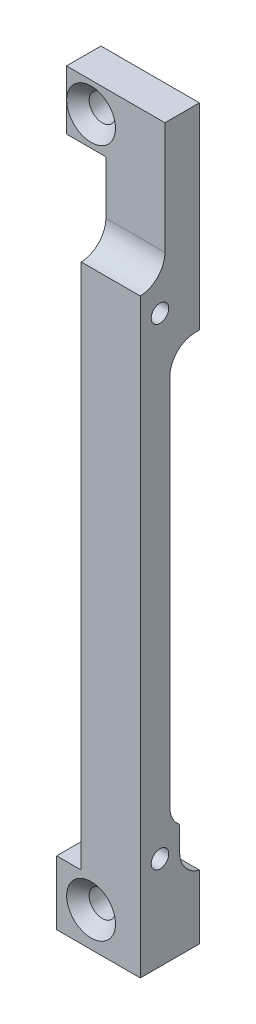
ISO-10303-21;
HEADER;
FILE_DESCRIPTION(('STEP AP214'),'2;1');
FILE_NAME('part.step','',(''),(''),'','','');
FILE_SCHEMA(('AUTOMOTIVE_DESIGN { 1 0 10303 214 1 1 1 1 }'));
ENDSEC;
DATA;
#1=APPLICATION_CONTEXT('core data for automotive mechanical design processes');
#2=APPLICATION_PROTOCOL_DEFINITION('international standard','automotive_design',2000,#1);
#3=PRODUCT_CONTEXT('',#1,'mechanical');
#4=PRODUCT('Part','Part','',(#3));
#5=PRODUCT_RELATED_PRODUCT_CATEGORY('part','',(#4));
#6=PRODUCT_DEFINITION_FORMATION('','',#4);
#7=PRODUCT_DEFINITION_CONTEXT('part definition',#1,'design');
#8=PRODUCT_DEFINITION('design','',#6,#7);
#9=PRODUCT_DEFINITION_SHAPE('','',#8);
#10=(LENGTH_UNIT() NAMED_UNIT(*) SI_UNIT(.MILLI.,.METRE.));
#11=(NAMED_UNIT(*) PLANE_ANGLE_UNIT() SI_UNIT($,.RADIAN.));
#12=(NAMED_UNIT(*) SI_UNIT($,.STERADIAN.) SOLID_ANGLE_UNIT());
#13=UNCERTAINTY_MEASURE_WITH_UNIT(LENGTH_MEASURE(1.E-05),#10,'distance_accuracy_value','');
#14=(GEOMETRIC_REPRESENTATION_CONTEXT(3) GLOBAL_UNCERTAINTY_ASSIGNED_CONTEXT((#13)) GLOBAL_UNIT_ASSIGNED_CONTEXT((#10,
#11,#12)) REPRESENTATION_CONTEXT('',''));
#15=CARTESIAN_POINT('',(0.,0.,0.));
#16=DIRECTION('',(0.,0.,1.));
#17=DIRECTION('',(1.,0.,0.));
#18=AXIS2_PLACEMENT_3D('',#15,#16,#17);
#19=CARTESIAN_POINT('',(-5.08,-25.4,3.81));
#20=DIRECTION('',(0.,0.,1.));
#21=DIRECTION('',(0.,-1.,0.));
#22=AXIS2_PLACEMENT_3D('',#19,#20,#21);
#23=PLANE('',#22);
#24=DIRECTION('',(0.,-1.,0.));
#25=VECTOR('',#24,1.);
#26=CARTESIAN_POINT('',(7.62,-25.4,3.81));
#27=LINE('',#26,#25);
#28=CARTESIAN_POINT('',(7.62,-28.702,3.81));
#29=VERTEX_POINT('',#28);
#30=CARTESIAN_POINT('',(7.62,-76.7722745054463,3.80999999999999));
#31=VERTEX_POINT('',#30);
#32=EDGE_CURVE('E272',#29,#31,#27,.T.);
#33=ORIENTED_EDGE('',*,*,#32,.T.);
#34=DIRECTION('',(-1.,0.,0.));
#35=VECTOR('',#34,1.);
#36=CARTESIAN_POINT('',(-5.08,-76.7722745054463,3.80999999999999));
#37=LINE('',#36,#35);
#38=CARTESIAN_POINT('',(0.,-76.7722745054463,3.80999999999999));
#39=VERTEX_POINT('',#38);
#40=EDGE_CURVE('E236',#31,#39,#37,.T.);
#41=ORIENTED_EDGE('',*,*,#40,.T.);
#42=DIRECTION('',(0.,-1.,0.));
#43=VECTOR('',#42,1.);
#44=CARTESIAN_POINT('',(0.,-93.98,3.80999999999999));
#45=LINE('',#44,#43);
#46=CARTESIAN_POINT('',(0.,-28.702,3.81));
#47=VERTEX_POINT('',#46);
#48=EDGE_CURVE('E218',#47,#39,#45,.T.);
#49=ORIENTED_EDGE('',*,*,#48,.F.);
#50=DIRECTION('',(1.,0.,0.));
#51=VECTOR('',#50,1.);
#52=CARTESIAN_POINT('',(7.62,-28.702,3.81));
#53=LINE('',#52,#51);
#54=EDGE_CURVE('E233',#47,#29,#53,.T.);
#55=ORIENTED_EDGE('',*,*,#54,.T.);
#56=EDGE_LOOP('',(#33,#41,#49,#55));
#57=FACE_BOUND('',#56,.T.);
#58=ADVANCED_FACE('F38',(#57),#23,.F.);
#59=CARTESIAN_POINT('',(-5.08,-85.725,0.));
#60=DIRECTION('',(0.,-1.,0.));
#61=DIRECTION('',(0.,0.,-1.));
#62=AXIS2_PLACEMENT_3D('',#59,#60,#61);
#63=PLANE('',#62);
#64=DIRECTION('',(0.,0.,1.));
#65=VECTOR('',#64,1.);
#66=CARTESIAN_POINT('',(0.,-85.725,0.));
#67=LINE('',#66,#65);
#68=CARTESIAN_POINT('',(0.,-85.725,0.));
#69=VERTEX_POINT('',#68);
#70=CARTESIAN_POINT('',(0.,-85.725,7.62));
#71=VERTEX_POINT('',#70);
#72=EDGE_CURVE('E312',#69,#71,#67,.T.);
#73=ORIENTED_EDGE('',*,*,#72,.F.);
#74=DIRECTION('',(1.,0.,0.));
#75=VECTOR('',#74,1.);
#76=CARTESIAN_POINT('',(7.62,-85.725,0.));
#77=LINE('',#76,#75);
#78=CARTESIAN_POINT('',(-3.175,-85.725,0.));
#79=VERTEX_POINT('',#78);
#80=EDGE_CURVE('E215',#79,#69,#77,.T.);
#81=ORIENTED_EDGE('',*,*,#80,.F.);
#82=DIRECTION('',(0.,0.,1.));
#83=VECTOR('',#82,1.);
#84=CARTESIAN_POINT('',(-3.175,-85.725,0.));
#85=LINE('',#84,#83);
#86=CARTESIAN_POINT('',(-3.175,-85.725,7.62));
#87=VERTEX_POINT('',#86);
#88=EDGE_CURVE('E279',#79,#87,#85,.T.);
#89=ORIENTED_EDGE('',*,*,#88,.T.);
#90=DIRECTION('',(1.,0.,0.));
#91=VECTOR('',#90,1.);
#92=CARTESIAN_POINT('',(-3.175,-85.725,7.62));
#93=LINE('',#92,#91);
#94=EDGE_CURVE('E275',#87,#71,#93,.T.);
#95=ORIENTED_EDGE('',*,*,#94,.T.);
#96=EDGE_LOOP('',(#73,#81,#89,#95));
#97=FACE_BOUND('',#96,.T.);
#98=ADVANCED_FACE('F375',(#97),#63,.F.);
#99=CARTESIAN_POINT('',(7.62,-93.98,7.62));
#100=DIRECTION('',(-1.,0.,0.));
#101=DIRECTION('',(0.,0.,1.));
#102=AXIS2_PLACEMENT_3D('',#99,#100,#101);
#103=PLANE('',#102);
#104=CARTESIAN_POINT('',(7.62,-20.9677,5.08));
#105=DIRECTION('',(1.,0.,0.));
#106=DIRECTION('',(0.,0.,-1.));
#107=AXIS2_PLACEMENT_3D('',#104,#105,#106);
#108=CIRCLE('',#107,1.13029999999999);
#109=CARTESIAN_POINT('',(7.62,-20.9677,3.94970000000001));
#110=VERTEX_POINT('',#109);
#111=EDGE_CURVE('E230',#110,#110,#108,.T.);
#112=ORIENTED_EDGE('',*,*,#111,.F.);
#113=EDGE_LOOP('',(#112));
#114=FACE_BOUND('',#113,.T.);
#115=CARTESIAN_POINT('',(7.62,-81.9277,5.07999999999999));
#116=DIRECTION('',(1.,0.,0.));
#117=DIRECTION('',(0.,0.,-1.));
#118=AXIS2_PLACEMENT_3D('',#115,#116,#117);
#119=CIRCLE('',#118,1.13029999999999);
#120=CARTESIAN_POINT('',(7.62,-81.9277,3.9497));
#121=VERTEX_POINT('',#120);
#122=EDGE_CURVE('E226',#121,#121,#119,.T.);
#123=ORIENTED_EDGE('',*,*,#122,.F.);
#124=EDGE_LOOP('',(#123));
#125=FACE_BOUND('',#124,.T.);
#126=DIRECTION('',(0.,1.,0.));
#127=VECTOR('',#126,1.);
#128=CARTESIAN_POINT('',(7.62,-93.98,7.62));
#129=LINE('',#128,#127);
#130=CARTESIAN_POINT('',(7.62,-93.98,7.62));
#131=VERTEX_POINT('',#130);
#132=CARTESIAN_POINT('',(7.61999999999999,-17.78,7.62));
#133=VERTEX_POINT('',#132);
#134=EDGE_CURVE('E153',#131,#133,#129,.T.);
#135=ORIENTED_EDGE('',*,*,#134,.F.);
#136=DIRECTION('',(0.,0.,-1.));
#137=VECTOR('',#136,1.);
#138=CARTESIAN_POINT('',(7.62,-93.98,7.62));
#139=LINE('',#138,#137);
#140=CARTESIAN_POINT('',(7.62,-93.98,0.));
#141=VERTEX_POINT('',#140);
#142=EDGE_CURVE('E157',#131,#141,#139,.T.);
#143=ORIENTED_EDGE('',*,*,#142,.T.);
#144=DIRECTION('',(0.,1.,0.));
#145=VECTOR('',#144,1.);
#146=CARTESIAN_POINT('',(7.62,0.,0.));
#147=LINE('',#146,#145);
#148=CARTESIAN_POINT('',(7.62,-85.725,0.));
#149=VERTEX_POINT('',#148);
#150=EDGE_CURVE('E172',#141,#149,#147,.T.);
#151=ORIENTED_EDGE('',*,*,#150,.T.);
#152=CARTESIAN_POINT('',(7.62,-82.5121258972689,-0.762000000000007));
#153=DIRECTION('',(-1.,0.,0.));
#154=DIRECTION('',(0.,0.,1.));
#155=AXIS2_PLACEMENT_3D('',#152,#153,#154);
#156=CIRCLE('',#155,3.302);
#157=CARTESIAN_POINT('',(7.62,-82.5121258972689,2.53999999999999));
#158=VERTEX_POINT('',#157);
#159=EDGE_CURVE('E245',#149,#158,#156,.T.);
#160=ORIENTED_EDGE('',*,*,#159,.T.);
#161=DIRECTION('',(0.,-1.,0.));
#162=VECTOR('',#161,1.);
#163=CARTESIAN_POINT('',(7.62,-85.725,2.53999999999999));
#164=LINE('',#163,#162);
#165=CARTESIAN_POINT('',(7.62,-79.375,2.53999999999999));
#166=VERTEX_POINT('',#165);
#167=EDGE_CURVE('E330',#166,#158,#164,.T.);
#168=ORIENTED_EDGE('',*,*,#167,.F.);
#169=CARTESIAN_POINT('',(7.62,-76.7722745054463,0.507999999999994));
#170=DIRECTION('',(-1.,0.,0.));
#171=DIRECTION('',(0.,0.,1.));
#172=AXIS2_PLACEMENT_3D('',#169,#170,#171);
#173=CIRCLE('',#172,3.302);
#174=EDGE_CURVE('E247',#166,#31,#173,.T.);
#175=ORIENTED_EDGE('',*,*,#174,.T.);
#176=ORIENTED_EDGE('',*,*,#32,.F.);
#177=CARTESIAN_POINT('',(7.62,-28.702,0.507999999999999));
#178=DIRECTION('',(-1.,0.,0.));
#179=DIRECTION('',(0.,0.,1.));
#180=AXIS2_PLACEMENT_3D('',#177,#178,#179);
#181=CIRCLE('',#180,3.302);
#182=CARTESIAN_POINT('',(7.62,-25.4,0.508000000000002));
#183=VERTEX_POINT('',#182);
#184=EDGE_CURVE('E251',#29,#183,#181,.T.);
#185=ORIENTED_EDGE('',*,*,#184,.T.);
#186=DIRECTION('',(0.,0.,1.));
#187=VECTOR('',#186,1.);
#188=CARTESIAN_POINT('',(7.62,-25.4,0.));
#189=LINE('',#188,#187);
#190=CARTESIAN_POINT('',(7.62,-25.4,0.));
#191=VERTEX_POINT('',#190);
#192=EDGE_CURVE('E270',#191,#183,#189,.T.);
#193=ORIENTED_EDGE('',*,*,#192,.F.);
#194=DIRECTION('',(0.,1.,0.));
#195=VECTOR('',#194,1.);
#196=CARTESIAN_POINT('',(7.62,-93.98,0.));
#197=LINE('',#196,#195);
#198=CARTESIAN_POINT('',(7.62,0.,0.));
#199=VERTEX_POINT('',#198);
#200=EDGE_CURVE('E192',#191,#199,#197,.T.);
#201=ORIENTED_EDGE('',*,*,#200,.T.);
#202=DIRECTION('',(0.,0.,-1.));
#203=VECTOR('',#202,1.);
#204=CARTESIAN_POINT('',(7.62,0.,7.62));
#205=LINE('',#204,#203);
#206=CARTESIAN_POINT('',(7.62,0.,4.445));
#207=VERTEX_POINT('',#206);
#208=EDGE_CURVE('E171',#207,#199,#205,.T.);
#209=ORIENTED_EDGE('',*,*,#208,.F.);
#210=DIRECTION('',(0.,1.,0.));
#211=VECTOR('',#210,1.);
#212=CARTESIAN_POINT('',(7.62,-93.98,4.445));
#213=LINE('',#212,#211);
#214=CARTESIAN_POINT('',(7.62,-14.4804432115813,4.445));
#215=VERTEX_POINT('',#214);
#216=EDGE_CURVE('E185',#215,#207,#213,.T.);
#217=ORIENTED_EDGE('',*,*,#216,.F.);
#218=CARTESIAN_POINT('',(7.62,-14.4804432115813,7.747));
#219=DIRECTION('',(-1.,0.,0.));
#220=DIRECTION('',(0.,0.,1.));
#221=AXIS2_PLACEMENT_3D('',#218,#219,#220);
#222=CIRCLE('',#221,3.302);
#223=EDGE_CURVE('E46',#215,#133,#222,.T.);
#224=ORIENTED_EDGE('',*,*,#223,.T.);
#225=EDGE_LOOP('',(#135,#143,#151,#160,#168,#175,#176,#185,#193,#201,#209,#217,#224));
#226=FACE_BOUND('',#225,.T.);
#227=ADVANCED_FACE('F155',(#114,#125,#226),#103,.F.);
#228=CARTESIAN_POINT('',(7.62,-93.98,0.));
#229=DIRECTION('',(0.,0.,1.));
#230=DIRECTION('',(1.,0.,0.));
#231=AXIS2_PLACEMENT_3D('',#228,#229,#230);
#232=PLANE('',#231);
#233=CARTESIAN_POINT('',(1.26999999999999,-89.535,0.));
#234=DIRECTION('',(0.,0.,1.));
#235=DIRECTION('',(1.,0.,0.));
#236=AXIS2_PLACEMENT_3D('',#233,#234,#235);
#237=CIRCLE('',#236,1.7);
#238=CARTESIAN_POINT('',(2.96999999999998,-89.535,0.));
#239=VERTEX_POINT('',#238);
#240=EDGE_CURVE('E333',#239,#239,#237,.T.);
#241=ORIENTED_EDGE('',*,*,#240,.T.);
#242=EDGE_LOOP('',(#241));
#243=FACE_BOUND('',#242,.T.);
#244=ORIENTED_EDGE('',*,*,#80,.T.);
#245=EDGE_CURVE('E214',#69,#149,#77,.T.);
#246=ORIENTED_EDGE('',*,*,#245,.T.);
#247=ORIENTED_EDGE('',*,*,#150,.F.);
#248=DIRECTION('',(1.,0.,0.));
#249=VECTOR('',#248,1.);
#250=CARTESIAN_POINT('',(0.,-93.98,0.));
#251=LINE('',#250,#249);
#252=CARTESIAN_POINT('',(-3.175,-93.98,0.));
#253=VERTEX_POINT('',#252);
#254=EDGE_CURVE('E170',#253,#141,#251,.T.);
#255=ORIENTED_EDGE('',*,*,#254,.F.);
#256=DIRECTION('',(0.,1.,0.));
#257=VECTOR('',#256,1.);
#258=CARTESIAN_POINT('',(-3.175,-85.725,0.));
#259=LINE('',#258,#257);
#260=EDGE_CURVE('E315',#253,#79,#259,.T.);
#261=ORIENTED_EDGE('',*,*,#260,.T.);
#262=EDGE_LOOP('',(#244,#246,#247,#255,#261));
#263=FACE_BOUND('',#262,.T.);
#264=ADVANCED_FACE('F393',(#243,#263),#232,.F.);
#265=CARTESIAN_POINT('',(-5.08,0.,7.62));
#266=DIRECTION('',(0.,-1.,0.));
#267=DIRECTION('',(0.,0.,-1.));
#268=AXIS2_PLACEMENT_3D('',#265,#266,#267);
#269=PLANE('',#268);
#270=DIRECTION('',(-1.,0.,0.));
#271=VECTOR('',#270,1.);
#272=CARTESIAN_POINT('',(-5.08,0.,4.445));
#273=LINE('',#272,#271);
#274=CARTESIAN_POINT('',(-5.08,0.,4.445));
#275=VERTEX_POINT('',#274);
#276=EDGE_CURVE('E286',#207,#275,#273,.T.);
#277=ORIENTED_EDGE('',*,*,#276,.F.);
#278=ORIENTED_EDGE('',*,*,#208,.T.);
#279=DIRECTION('',(-1.,0.,0.));
#280=VECTOR('',#279,1.);
#281=CARTESIAN_POINT('',(-5.08,0.,0.));
#282=LINE('',#281,#280);
#283=CARTESIAN_POINT('',(-5.08,0.,0.));
#284=VERTEX_POINT('',#283);
#285=EDGE_CURVE('E194',#199,#284,#282,.T.);
#286=ORIENTED_EDGE('',*,*,#285,.T.);
#287=DIRECTION('',(0.,0.,-1.));
#288=VECTOR('',#287,1.);
#289=CARTESIAN_POINT('',(-5.08,0.,7.62));
#290=LINE('',#289,#288);
#291=EDGE_CURVE('E204',#275,#284,#290,.T.);
#292=ORIENTED_EDGE('',*,*,#291,.F.);
#293=EDGE_LOOP('',(#277,#278,#286,#292));
#294=FACE_BOUND('',#293,.T.);
#295=ADVANCED_FACE('F300',(#294),#269,.F.);
#296=CARTESIAN_POINT('',(-5.08,-7.62,7.62));
#297=DIRECTION('',(1.,0.,0.));
#298=DIRECTION('',(0.,0.,-1.));
#299=AXIS2_PLACEMENT_3D('',#296,#297,#298);
#300=PLANE('',#299);
#301=DIRECTION('',(0.,-1.,0.));
#302=VECTOR('',#301,1.);
#303=CARTESIAN_POINT('',(-5.08,0.,4.445));
#304=LINE('',#303,#302);
#305=CARTESIAN_POINT('',(-5.08,-7.62,4.445));
#306=VERTEX_POINT('',#305);
#307=EDGE_CURVE('E284',#275,#306,#304,.T.);
#308=ORIENTED_EDGE('',*,*,#307,.F.);
#309=ORIENTED_EDGE('',*,*,#291,.T.);
#310=DIRECTION('',(0.,-1.,0.));
#311=VECTOR('',#310,1.);
#312=CARTESIAN_POINT('',(-5.08,-7.62,0.));
#313=LINE('',#312,#311);
#314=CARTESIAN_POINT('',(-5.08,-7.62,0.));
#315=VERTEX_POINT('',#314);
#316=EDGE_CURVE('E196',#284,#315,#313,.T.);
#317=ORIENTED_EDGE('',*,*,#316,.T.);
#318=DIRECTION('',(0.,0.,-1.));
#319=VECTOR('',#318,1.);
#320=CARTESIAN_POINT('',(-5.08,-7.62,7.62));
#321=LINE('',#320,#319);
#322=EDGE_CURVE('E202',#306,#315,#321,.T.);
#323=ORIENTED_EDGE('',*,*,#322,.F.);
#324=EDGE_LOOP('',(#308,#309,#317,#323));
#325=FACE_BOUND('',#324,.T.);
#326=ADVANCED_FACE('F303',(#325),#300,.F.);
#327=CARTESIAN_POINT('',(0.,-7.62,7.62));
#328=DIRECTION('',(0.,1.,0.));
#329=DIRECTION('',(-1.,0.,0.));
#330=AXIS2_PLACEMENT_3D('',#327,#328,#329);
#331=PLANE('',#330);
#332=DIRECTION('',(1.,0.,0.));
#333=VECTOR('',#332,1.);
#334=CARTESIAN_POINT('',(0.,-7.62,4.445));
#335=LINE('',#334,#333);
#336=CARTESIAN_POINT('',(0.,-7.62,4.445));
#337=VERTEX_POINT('',#336);
#338=EDGE_CURVE('E287',#306,#337,#335,.T.);
#339=ORIENTED_EDGE('',*,*,#338,.F.);
#340=ORIENTED_EDGE('',*,*,#322,.T.);
#341=DIRECTION('',(1.,0.,0.));
#342=VECTOR('',#341,1.);
#343=CARTESIAN_POINT('',(0.,-7.62,0.));
#344=LINE('',#343,#342);
#345=CARTESIAN_POINT('',(0.,-7.62,0.));
#346=VERTEX_POINT('',#345);
#347=EDGE_CURVE('E182',#315,#346,#344,.T.);
#348=ORIENTED_EDGE('',*,*,#347,.T.);
#349=DIRECTION('',(0.,0.,-1.));
#350=VECTOR('',#349,1.);
#351=CARTESIAN_POINT('',(0.,-7.62,7.62));
#352=LINE('',#351,#350);
#353=EDGE_CURVE('E190',#337,#346,#352,.T.);
#354=ORIENTED_EDGE('',*,*,#353,.F.);
#355=EDGE_LOOP('',(#339,#340,#348,#354));
#356=FACE_BOUND('',#355,.T.);
#357=ADVANCED_FACE('F311',(#356),#331,.F.);
#358=CARTESIAN_POINT('',(0.,-93.98,7.62));
#359=DIRECTION('',(0.,1.,0.));
#360=DIRECTION('',(0.,0.,1.));
#361=AXIS2_PLACEMENT_3D('',#358,#359,#360);
#362=PLANE('',#361);
#363=ORIENTED_EDGE('',*,*,#254,.T.);
#364=ORIENTED_EDGE('',*,*,#142,.F.);
#365=DIRECTION('',(1.,0.,0.));
#366=VECTOR('',#365,1.);
#367=CARTESIAN_POINT('',(0.,-93.98,7.62));
#368=LINE('',#367,#366);
#369=CARTESIAN_POINT('',(-3.175,-93.98,7.62));
#370=VERTEX_POINT('',#369);
#371=EDGE_CURVE('E163',#370,#131,#368,.T.);
#372=ORIENTED_EDGE('',*,*,#371,.F.);
#373=DIRECTION('',(0.,0.,-1.));
#374=VECTOR('',#373,1.);
#375=CARTESIAN_POINT('',(-3.175,-93.98,0.));
#376=LINE('',#375,#374);
#377=EDGE_CURVE('E318',#370,#253,#376,.T.);
#378=ORIENTED_EDGE('',*,*,#377,.T.);
#379=EDGE_LOOP('',(#363,#364,#372,#378));
#380=FACE_BOUND('',#379,.T.);
#381=ADVANCED_FACE('F167',(#380),#362,.F.);
#382=CARTESIAN_POINT('',(0.,-93.98,7.62));
#383=DIRECTION('',(1.,0.,0.));
#384=DIRECTION('',(0.,0.,-1.));
#385=AXIS2_PLACEMENT_3D('',#382,#383,#384);
#386=PLANE('',#385);
#387=CARTESIAN_POINT('',(0.,-20.9677,5.08));
#388=DIRECTION('',(1.,0.,0.));
#389=DIRECTION('',(0.,0.,-1.));
#390=AXIS2_PLACEMENT_3D('',#387,#388,#389);
#391=CIRCLE('',#390,1.13029999999999);
#392=CARTESIAN_POINT('',(0.,-20.9677,3.94970000000001));
#393=VERTEX_POINT('',#392);
#394=EDGE_CURVE('E227',#393,#393,#391,.T.);
#395=ORIENTED_EDGE('',*,*,#394,.T.);
#396=EDGE_LOOP('',(#395));
#397=FACE_BOUND('',#396,.T.);
#398=CARTESIAN_POINT('',(0.,-81.9277,5.07999999999999));
#399=DIRECTION('',(1.,0.,0.));
#400=DIRECTION('',(0.,0.,-1.));
#401=AXIS2_PLACEMENT_3D('',#398,#399,#400);
#402=CIRCLE('',#401,1.13029999999999);
#403=CARTESIAN_POINT('',(0.,-81.9277,3.9497));
#404=VERTEX_POINT('',#403);
#405=EDGE_CURVE('E222',#404,#404,#402,.T.);
#406=ORIENTED_EDGE('',*,*,#405,.T.);
#407=EDGE_LOOP('',(#406));
#408=FACE_BOUND('',#407,.T.);
#409=DIRECTION('',(0.,0.,1.));
#410=VECTOR('',#409,1.);
#411=CARTESIAN_POINT('',(0.,-25.4,7.62000000000006));
#412=LINE('',#411,#410);
#413=CARTESIAN_POINT('',(0.,-25.4,0.));
#414=VERTEX_POINT('',#413);
#415=CARTESIAN_POINT('',(0.,-25.4,0.508000000000002));
#416=VERTEX_POINT('',#415);
#417=EDGE_CURVE('E259',#414,#416,#412,.T.);
#418=ORIENTED_EDGE('',*,*,#417,.T.);
#419=CARTESIAN_POINT('',(0.,-28.702,0.507999999999999));
#420=DIRECTION('',(1.,0.,0.));
#421=DIRECTION('',(0.,0.,-1.));
#422=AXIS2_PLACEMENT_3D('',#419,#420,#421);
#423=CIRCLE('',#422,3.302);
#424=EDGE_CURVE('E253',#416,#47,#423,.T.);
#425=ORIENTED_EDGE('',*,*,#424,.T.);
#426=ORIENTED_EDGE('',*,*,#48,.T.);
#427=CARTESIAN_POINT('',(0.,-76.7722745054463,0.507999999999994));
#428=DIRECTION('',(1.,0.,0.));
#429=DIRECTION('',(0.,0.,-1.));
#430=AXIS2_PLACEMENT_3D('',#427,#428,#429);
#431=CIRCLE('',#430,3.302);
#432=CARTESIAN_POINT('',(0.,-79.375,2.53999999999999));
#433=VERTEX_POINT('',#432);
#434=EDGE_CURVE('E249',#39,#433,#431,.T.);
#435=ORIENTED_EDGE('',*,*,#434,.T.);
#436=DIRECTION('',(0.,1.,0.));
#437=VECTOR('',#436,1.);
#438=CARTESIAN_POINT('',(0.,-85.725,2.53999999999999));
#439=LINE('',#438,#437);
#440=CARTESIAN_POINT('',(0.,-82.5121258972689,2.53999999999999));
#441=VERTEX_POINT('',#440);
#442=EDGE_CURVE('E321',#441,#433,#439,.T.);
#443=ORIENTED_EDGE('',*,*,#442,.F.);
#444=CARTESIAN_POINT('',(0.,-82.5121258972689,-0.762000000000007));
#445=DIRECTION('',(1.,0.,0.));
#446=DIRECTION('',(0.,0.,-1.));
#447=AXIS2_PLACEMENT_3D('',#444,#445,#446);
#448=CIRCLE('',#447,3.302);
#449=EDGE_CURVE('E242',#441,#69,#448,.T.);
#450=ORIENTED_EDGE('',*,*,#449,.T.);
#451=ORIENTED_EDGE('',*,*,#72,.T.);
#452=DIRECTION('',(0.,-1.,0.));
#453=VECTOR('',#452,1.);
#454=CARTESIAN_POINT('',(0.,-93.98,7.62));
#455=LINE('',#454,#453);
#456=CARTESIAN_POINT('',(0.,-17.78,7.62));
#457=VERTEX_POINT('',#456);
#458=EDGE_CURVE('E162',#457,#71,#455,.T.);
#459=ORIENTED_EDGE('',*,*,#458,.F.);
#460=CARTESIAN_POINT('',(0.,-14.4804432115813,7.747));
#461=DIRECTION('',(1.,0.,0.));
#462=DIRECTION('',(0.,0.,-1.));
#463=AXIS2_PLACEMENT_3D('',#460,#461,#462);
#464=CIRCLE('',#463,3.302);
#465=CARTESIAN_POINT('',(0.,-14.4804432115813,4.445));
#466=VERTEX_POINT('',#465);
#467=EDGE_CURVE('E11',#457,#466,#464,.T.);
#468=ORIENTED_EDGE('',*,*,#467,.T.);
#469=DIRECTION('',(0.,-1.,0.));
#470=VECTOR('',#469,1.);
#471=CARTESIAN_POINT('',(0.,-93.98,4.445));
#472=LINE('',#471,#470);
#473=EDGE_CURVE('E209',#337,#466,#472,.T.);
#474=ORIENTED_EDGE('',*,*,#473,.F.);
#475=ORIENTED_EDGE('',*,*,#353,.T.);
#476=DIRECTION('',(0.,-1.,0.));
#477=VECTOR('',#476,1.);
#478=CARTESIAN_POINT('',(0.,-93.98,0.));
#479=LINE('',#478,#477);
#480=EDGE_CURVE('E179',#346,#414,#479,.T.);
#481=ORIENTED_EDGE('',*,*,#480,.T.);
#482=EDGE_LOOP('',(#418,#425,#426,#435,#443,#450,#451,#459,#468,#474,#475,#481));
#483=FACE_BOUND('',#482,.T.);
#484=ADVANCED_FACE('F257',(#397,#408,#483),#386,.F.);
#485=CARTESIAN_POINT('',(7.62,-93.98,7.62));
#486=DIRECTION('',(0.,0.,1.));
#487=DIRECTION('',(1.,0.,0.));
#488=AXIS2_PLACEMENT_3D('',#485,#486,#487);
#489=PLANE('',#488);
#490=ORIENTED_EDGE('',*,*,#371,.T.);
#491=ORIENTED_EDGE('',*,*,#134,.T.);
#492=DIRECTION('',(1.,0.,0.));
#493=VECTOR('',#492,1.);
#494=CARTESIAN_POINT('',(7.62,-17.78,7.62));
#495=LINE('',#494,#493);
#496=EDGE_CURVE('E207',#457,#133,#495,.T.);
#497=ORIENTED_EDGE('',*,*,#496,.F.);
#498=ORIENTED_EDGE('',*,*,#458,.T.);
#499=ORIENTED_EDGE('',*,*,#94,.F.);
#500=DIRECTION('',(0.,-1.,0.));
#501=VECTOR('',#500,1.);
#502=CARTESIAN_POINT('',(-3.175,-85.725,7.62));
#503=LINE('',#502,#501);
#504=EDGE_CURVE('E178',#87,#370,#503,.T.);
#505=ORIENTED_EDGE('',*,*,#504,.T.);
#506=EDGE_LOOP('',(#490,#491,#497,#498,#499,#505));
#507=FACE_BOUND('',#506,.T.);
#508=CARTESIAN_POINT('',(1.26999999999999,-89.535,7.62));
#509=DIRECTION('',(0.,0.,1.));
#510=DIRECTION('',(1.,0.,0.));
#511=AXIS2_PLACEMENT_3D('',#508,#509,#510);
#512=CIRCLE('',#511,3.15);
#513=CARTESIAN_POINT('',(4.41999999999999,-89.535,7.62));
#514=VERTEX_POINT('',#513);
#515=EDGE_CURVE('E339',#514,#514,#512,.T.);
#516=ORIENTED_EDGE('',*,*,#515,.F.);
#517=EDGE_LOOP('',(#516));
#518=FACE_BOUND('',#517,.T.);
#519=ADVANCED_FACE('F175',(#507,#518),#489,.T.);
#520=CARTESIAN_POINT('',(-1.905,-3.81,0.));
#521=DIRECTION('',(0.,0.,1.));
#522=DIRECTION('',(1.,0.,0.));
#523=AXIS2_PLACEMENT_3D('',#520,#521,#522);
#524=CIRCLE('',#523,1.7);
#525=CARTESIAN_POINT('',(-0.205000000000001,-3.81,0.));
#526=VERTEX_POINT('',#525);
#527=EDGE_CURVE('E342',#526,#526,#524,.T.);
#528=ORIENTED_EDGE('',*,*,#527,.T.);
#529=EDGE_LOOP('',(#528));
#530=FACE_BOUND('',#529,.T.);
#531=ORIENTED_EDGE('',*,*,#285,.F.);
#532=ORIENTED_EDGE('',*,*,#200,.F.);
#533=DIRECTION('',(-1.,0.,0.));
#534=VECTOR('',#533,1.);
#535=CARTESIAN_POINT('',(7.62,-25.4,0.));
#536=LINE('',#535,#534);
#537=EDGE_CURVE('E211',#191,#414,#536,.T.);
#538=ORIENTED_EDGE('',*,*,#537,.T.);
#539=ORIENTED_EDGE('',*,*,#480,.F.);
#540=ORIENTED_EDGE('',*,*,#347,.F.);
#541=ORIENTED_EDGE('',*,*,#316,.F.);
#542=EDGE_LOOP('',(#531,#532,#538,#539,#540,#541));
#543=FACE_BOUND('',#542,.T.);
#544=ADVANCED_FACE('F307',(#530,#543),#232,.F.);
#545=CARTESIAN_POINT('',(-5.08,-17.78,4.445));
#546=DIRECTION('',(0.,0.,1.));
#547=DIRECTION('',(1.,0.,0.));
#548=AXIS2_PLACEMENT_3D('',#545,#546,#547);
#549=PLANE('',#548);
#550=ORIENTED_EDGE('',*,*,#473,.T.);
#551=DIRECTION('',(1.,0.,0.));
#552=VECTOR('',#551,1.);
#553=CARTESIAN_POINT('',(7.61999999999999,-14.4804432115813,4.445));
#554=LINE('',#553,#552);
#555=EDGE_CURVE('E240',#466,#215,#554,.T.);
#556=ORIENTED_EDGE('',*,*,#555,.T.);
#557=ORIENTED_EDGE('',*,*,#216,.T.);
#558=ORIENTED_EDGE('',*,*,#276,.T.);
#559=ORIENTED_EDGE('',*,*,#307,.T.);
#560=ORIENTED_EDGE('',*,*,#338,.T.);
#561=EDGE_LOOP('',(#550,#556,#557,#558,#559,#560));
#562=FACE_BOUND('',#561,.T.);
#563=CARTESIAN_POINT('',(-1.905,-3.81,4.445));
#564=DIRECTION('',(0.,0.,1.));
#565=DIRECTION('',(1.,0.,0.));
#566=AXIS2_PLACEMENT_3D('',#563,#564,#565);
#567=CIRCLE('',#566,3.15);
#568=CARTESIAN_POINT('',(1.245,-3.81,4.445));
#569=VERTEX_POINT('',#568);
#570=EDGE_CURVE('E225',#569,#569,#567,.T.);
#571=ORIENTED_EDGE('',*,*,#570,.F.);
#572=EDGE_LOOP('',(#571));
#573=FACE_BOUND('',#572,.T.);
#574=ADVANCED_FACE('F291',(#562,#573),#549,.T.);
#575=CARTESIAN_POINT('',(-5.08,-25.4,0.));
#576=DIRECTION('',(0.,1.,0.));
#577=DIRECTION('',(0.,0.,1.));
#578=AXIS2_PLACEMENT_3D('',#575,#576,#577);
#579=PLANE('',#578);
#580=ORIENTED_EDGE('',*,*,#192,.T.);
#581=DIRECTION('',(1.,0.,0.));
#582=VECTOR('',#581,1.);
#583=CARTESIAN_POINT('',(0.,-25.4,0.508000000000002));
#584=LINE('',#583,#582);
#585=EDGE_CURVE('E238',#183,#416,#584,.F.);
#586=ORIENTED_EDGE('',*,*,#585,.T.);
#587=ORIENTED_EDGE('',*,*,#417,.F.);
#588=ORIENTED_EDGE('',*,*,#537,.F.);
#589=EDGE_LOOP('',(#580,#586,#587,#588));
#590=FACE_BOUND('',#589,.T.);
#591=ADVANCED_FACE('F274',(#590),#579,.F.);
#592=CARTESIAN_POINT('',(-3.175,-93.98,0.));
#593=DIRECTION('',(1.,0.,0.));
#594=DIRECTION('',(0.,0.,1.));
#595=AXIS2_PLACEMENT_3D('',#592,#593,#594);
#596=PLANE('',#595);
#597=ORIENTED_EDGE('',*,*,#260,.F.);
#598=ORIENTED_EDGE('',*,*,#377,.F.);
#599=ORIENTED_EDGE('',*,*,#504,.F.);
#600=ORIENTED_EDGE('',*,*,#88,.F.);
#601=EDGE_LOOP('',(#597,#598,#599,#600));
#602=FACE_BOUND('',#601,.T.);
#603=ADVANCED_FACE('F385',(#602),#596,.F.);
#604=CARTESIAN_POINT('',(7.62,-79.375,2.53999999999999));
#605=DIRECTION('',(0.,0.,1.));
#606=DIRECTION('',(0.,-1.,0.));
#607=AXIS2_PLACEMENT_3D('',#604,#605,#606);
#608=PLANE('',#607);
#609=ORIENTED_EDGE('',*,*,#167,.T.);
#610=DIRECTION('',(-1.,0.,0.));
#611=VECTOR('',#610,1.);
#612=CARTESIAN_POINT('',(7.62,-82.5121258972689,2.53999999999999));
#613=LINE('',#612,#611);
#614=EDGE_CURVE('E221',#158,#441,#613,.T.);
#615=ORIENTED_EDGE('',*,*,#614,.T.);
#616=ORIENTED_EDGE('',*,*,#442,.T.);
#617=DIRECTION('',(1.,0.,0.));
#618=VECTOR('',#617,1.);
#619=CARTESIAN_POINT('',(7.62,-79.375,2.53999999999999));
#620=LINE('',#619,#618);
#621=EDGE_CURVE('E316',#433,#166,#620,.T.);
#622=ORIENTED_EDGE('',*,*,#621,.T.);
#623=EDGE_LOOP('',(#609,#615,#616,#622));
#624=FACE_BOUND('',#623,.T.);
#625=ADVANCED_FACE('F362',(#624),#608,.F.);
#626=CARTESIAN_POINT('',(1.26999999999999,-89.535,7.62));
#627=DIRECTION('',(0.,0.,1.));
#628=DIRECTION('',(1.,0.,0.));
#629=AXIS2_PLACEMENT_3D('',#626,#627,#628);
#630=CYLINDRICAL_SURFACE('',#629,1.69999999999999);
#631=ORIENTED_EDGE('',*,*,#240,.F.);
#632=EDGE_LOOP('',(#631));
#633=FACE_BOUND('',#632,.T.);
#634=CARTESIAN_POINT('',(1.26999999999999,-89.535,6.16999999999999));
#635=DIRECTION('',(0.,0.,1.));
#636=DIRECTION('',(1.,0.,0.));
#637=AXIS2_PLACEMENT_3D('',#634,#635,#636);
#638=CIRCLE('',#637,1.69999999999999);
#639=CARTESIAN_POINT('',(2.96999999999997,-89.535,6.16999999999999));
#640=VERTEX_POINT('',#639);
#641=EDGE_CURVE('E336',#640,#640,#638,.T.);
#642=ORIENTED_EDGE('',*,*,#641,.T.);
#643=EDGE_LOOP('',(#642));
#644=FACE_BOUND('',#643,.T.);
#645=ADVANCED_FACE('F446',(#633,#644),#630,.F.);
#646=CARTESIAN_POINT('',(1.26999999999999,-89.535,7.62));
#647=DIRECTION('',(0.,0.,1.));
#648=DIRECTION('',(1.,0.,0.));
#649=AXIS2_PLACEMENT_3D('',#646,#647,#648);
#650=CONICAL_SURFACE('',#649,3.15,0.78539816339745);
#651=ORIENTED_EDGE('',*,*,#641,.F.);
#652=EDGE_LOOP('',(#651));
#653=FACE_BOUND('',#652,.T.);
#654=ORIENTED_EDGE('',*,*,#515,.T.);
#655=EDGE_LOOP('',(#654));
#656=FACE_BOUND('',#655,.T.);
#657=ADVANCED_FACE('F453',(#653,#656),#650,.F.);
#658=CARTESIAN_POINT('',(-1.905,-3.81,4.445));
#659=DIRECTION('',(0.,0.,1.));
#660=DIRECTION('',(1.,0.,0.));
#661=AXIS2_PLACEMENT_3D('',#658,#659,#660);
#662=CYLINDRICAL_SURFACE('',#661,1.69999999999999);
#663=ORIENTED_EDGE('',*,*,#527,.F.);
#664=EDGE_LOOP('',(#663));
#665=FACE_BOUND('',#664,.T.);
#666=CARTESIAN_POINT('',(-1.905,-3.81,2.99499999999999));
#667=DIRECTION('',(0.,0.,1.));
#668=DIRECTION('',(1.,0.,0.));
#669=AXIS2_PLACEMENT_3D('',#666,#667,#668);
#670=CIRCLE('',#669,1.69999999999999);
#671=CARTESIAN_POINT('',(-0.205000000000012,-3.81,2.99499999999999));
#672=VERTEX_POINT('',#671);
#673=EDGE_CURVE('E345',#672,#672,#670,.T.);
#674=ORIENTED_EDGE('',*,*,#673,.T.);
#675=EDGE_LOOP('',(#674));
#676=FACE_BOUND('',#675,.T.);
#677=ADVANCED_FACE('F461',(#665,#676),#662,.F.);
#678=CARTESIAN_POINT('',(-1.905,-3.81,4.445));
#679=DIRECTION('',(0.,0.,1.));
#680=DIRECTION('',(1.,0.,0.));
#681=AXIS2_PLACEMENT_3D('',#678,#679,#680);
#682=CONICAL_SURFACE('',#681,3.15,0.78539816339745);
#683=ORIENTED_EDGE('',*,*,#673,.F.);
#684=EDGE_LOOP('',(#683));
#685=FACE_BOUND('',#684,.T.);
#686=ORIENTED_EDGE('',*,*,#570,.T.);
#687=EDGE_LOOP('',(#686));
#688=FACE_BOUND('',#687,.T.);
#689=ADVANCED_FACE('F469',(#685,#688),#682,.F.);
#690=CARTESIAN_POINT('',(7.62,-81.9277,5.07999999999999));
#691=DIRECTION('',(1.,0.,0.));
#692=DIRECTION('',(0.,0.,-1.));
#693=AXIS2_PLACEMENT_3D('',#690,#691,#692);
#694=CYLINDRICAL_SURFACE('',#693,1.13029999999999);
#695=ORIENTED_EDGE('',*,*,#122,.T.);
#696=EDGE_LOOP('',(#695));
#697=FACE_BOUND('',#696,.T.);
#698=ORIENTED_EDGE('',*,*,#405,.F.);
#699=EDGE_LOOP('',(#698));
#700=FACE_BOUND('',#699,.T.);
#701=ADVANCED_FACE('F477',(#697,#700),#694,.F.);
#702=CARTESIAN_POINT('',(7.62,-20.9677,5.08));
#703=DIRECTION('',(1.,0.,0.));
#704=DIRECTION('',(0.,0.,-1.));
#705=AXIS2_PLACEMENT_3D('',#702,#703,#704);
#706=CYLINDRICAL_SURFACE('',#705,1.13029999999999);
#707=ORIENTED_EDGE('',*,*,#111,.T.);
#708=EDGE_LOOP('',(#707));
#709=FACE_BOUND('',#708,.T.);
#710=ORIENTED_EDGE('',*,*,#394,.F.);
#711=EDGE_LOOP('',(#710));
#712=FACE_BOUND('',#711,.T.);
#713=ADVANCED_FACE('F372',(#709,#712),#706,.F.);
#714=CARTESIAN_POINT('',(-5.08,-82.5121258972689,-0.762000000000007));
#715=DIRECTION('',(-1.,0.,0.));
#716=DIRECTION('',(0.,0.,1.));
#717=AXIS2_PLACEMENT_3D('',#714,#715,#716);
#718=CYLINDRICAL_SURFACE('',#717,3.302);
#719=ORIENTED_EDGE('',*,*,#159,.F.);
#720=ORIENTED_EDGE('',*,*,#245,.F.);
#721=ORIENTED_EDGE('',*,*,#449,.F.);
#722=ORIENTED_EDGE('',*,*,#614,.F.);
#723=EDGE_LOOP('',(#719,#720,#721,#722));
#724=FACE_BOUND('',#723,.T.);
#725=ADVANCED_FACE('F360',(#724),#718,.F.);
#726=CARTESIAN_POINT('',(7.62,-76.7722745054463,0.507999999999994));
#727=DIRECTION('',(-1.,0.,0.));
#728=DIRECTION('',(0.,0.,1.));
#729=AXIS2_PLACEMENT_3D('',#726,#727,#728);
#730=CYLINDRICAL_SURFACE('',#729,3.302);
#731=ORIENTED_EDGE('',*,*,#434,.F.);
#732=ORIENTED_EDGE('',*,*,#40,.F.);
#733=ORIENTED_EDGE('',*,*,#174,.F.);
#734=ORIENTED_EDGE('',*,*,#621,.F.);
#735=EDGE_LOOP('',(#731,#732,#733,#734));
#736=FACE_BOUND('',#735,.T.);
#737=ADVANCED_FACE('F365',(#736),#730,.F.);
#738=CARTESIAN_POINT('',(-5.08,-28.702,0.507999999999999));
#739=DIRECTION('',(-1.,0.,0.));
#740=DIRECTION('',(0.,0.,1.));
#741=AXIS2_PLACEMENT_3D('',#738,#739,#740);
#742=CYLINDRICAL_SURFACE('',#741,3.302);
#743=ORIENTED_EDGE('',*,*,#424,.F.);
#744=ORIENTED_EDGE('',*,*,#585,.F.);
#745=ORIENTED_EDGE('',*,*,#184,.F.);
#746=ORIENTED_EDGE('',*,*,#54,.F.);
#747=EDGE_LOOP('',(#743,#744,#745,#746));
#748=FACE_BOUND('',#747,.T.);
#749=ADVANCED_FACE('F267',(#748),#742,.F.);
#750=CARTESIAN_POINT('',(-5.08,-14.4804432115813,7.747));
#751=DIRECTION('',(-1.,0.,0.));
#752=DIRECTION('',(0.,0.,1.));
#753=AXIS2_PLACEMENT_3D('',#750,#751,#752);
#754=CYLINDRICAL_SURFACE('',#753,3.302);
#755=ORIENTED_EDGE('',*,*,#467,.F.);
#756=ORIENTED_EDGE('',*,*,#496,.T.);
#757=ORIENTED_EDGE('',*,*,#223,.F.);
#758=ORIENTED_EDGE('',*,*,#555,.F.);
#759=EDGE_LOOP('',(#755,#756,#757,#758));
#760=FACE_BOUND('',#759,.T.);
#761=ADVANCED_FACE('F40',(#760),#754,.F.);
#762=CLOSED_SHELL('',(#58,#98,#227,#264,#295,#326,#357,#381,#484,#519,#544,#574,#591,#603,#625,
#645,#657,#677,#689,#701,#713,#725,#737,#749,#761));
#763=MANIFOLD_SOLID_BREP('B2',#762);
#764=ADVANCED_BREP_SHAPE_REPRESENTATION('',(#18,#763),#14);
#765=SHAPE_DEFINITION_REPRESENTATION(#9,#764);
ENDSEC;
END-ISO-10303-21;
